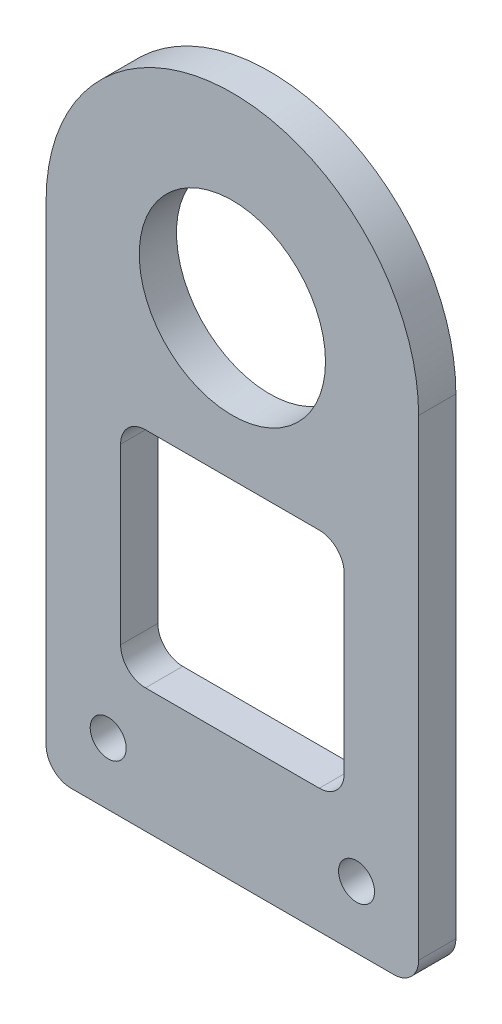
ISO-10303-21;
HEADER;
FILE_DESCRIPTION(('STEP AP214'),'2;1');
FILE_NAME('part.step','',(''),(''),'','','');
FILE_SCHEMA(('AUTOMOTIVE_DESIGN { 1 0 10303 214 1 1 1 1 }'));
ENDSEC;
DATA;
#1=APPLICATION_CONTEXT('core data for automotive mechanical design processes');
#2=APPLICATION_PROTOCOL_DEFINITION('international standard','automotive_design',2000,#1);
#3=PRODUCT_CONTEXT('',#1,'mechanical');
#4=PRODUCT('Part','Part','',(#3));
#5=PRODUCT_RELATED_PRODUCT_CATEGORY('part','',(#4));
#6=PRODUCT_DEFINITION_FORMATION('','',#4);
#7=PRODUCT_DEFINITION_CONTEXT('part definition',#1,'design');
#8=PRODUCT_DEFINITION('design','',#6,#7);
#9=PRODUCT_DEFINITION_SHAPE('','',#8);
#10=(LENGTH_UNIT() NAMED_UNIT(*) SI_UNIT(.MILLI.,.METRE.));
#11=(NAMED_UNIT(*) PLANE_ANGLE_UNIT() SI_UNIT($,.RADIAN.));
#12=(NAMED_UNIT(*) SI_UNIT($,.STERADIAN.) SOLID_ANGLE_UNIT());
#13=UNCERTAINTY_MEASURE_WITH_UNIT(LENGTH_MEASURE(1.E-05),#10,'distance_accuracy_value','');
#14=(GEOMETRIC_REPRESENTATION_CONTEXT(3) GLOBAL_UNCERTAINTY_ASSIGNED_CONTEXT((#13)) GLOBAL_UNIT_ASSIGNED_CONTEXT((#10,
#11,#12)) REPRESENTATION_CONTEXT('',''));
#15=CARTESIAN_POINT('',(0.,0.,0.));
#16=DIRECTION('',(0.,0.,1.));
#17=DIRECTION('',(1.,0.,0.));
#18=AXIS2_PLACEMENT_3D('',#15,#16,#17);
#19=CARTESIAN_POINT('',(0.,35.,3.));
#20=DIRECTION('',(0.,0.,1.));
#21=DIRECTION('',(1.,0.,0.));
#22=AXIS2_PLACEMENT_3D('',#19,#20,#21);
#23=PLANE('',#22);
#24=CARTESIAN_POINT('',(-10.,0.,3.));
#25=DIRECTION('',(0.,0.,1.));
#26=DIRECTION('',(1.,0.,0.));
#27=AXIS2_PLACEMENT_3D('',#24,#25,#26);
#28=CIRCLE('',#27,1.45);
#29=CARTESIAN_POINT('',(-8.55,0.,3.));
#30=VERTEX_POINT('',#29);
#31=EDGE_CURVE('E307',#30,#30,#28,.T.);
#32=ORIENTED_EDGE('',*,*,#31,.F.);
#33=EDGE_LOOP('',(#32));
#34=FACE_BOUND('',#33,.T.);
#35=DIRECTION('',(1.,0.,0.));
#36=VECTOR('',#35,1.);
#37=CARTESIAN_POINT('',(15.,-4.99999999999999,3.));
#38=LINE('',#37,#36);
#39=CARTESIAN_POINT('',(-13.,-5.,3.));
#40=VERTEX_POINT('',#39);
#41=CARTESIAN_POINT('',(13.,-4.99999999999999,3.));
#42=VERTEX_POINT('',#41);
#43=EDGE_CURVE('E160',#40,#42,#38,.T.);
#44=ORIENTED_EDGE('',*,*,#43,.T.);
#45=CARTESIAN_POINT('',(13.,-3.,3.));
#46=DIRECTION('',(0.,0.,1.));
#47=DIRECTION('',(1.,0.,0.));
#48=AXIS2_PLACEMENT_3D('',#45,#46,#47);
#49=CIRCLE('',#48,2.);
#50=CARTESIAN_POINT('',(15.,-3.,3.));
#51=VERTEX_POINT('',#50);
#52=EDGE_CURVE('E204',#42,#51,#49,.T.);
#53=ORIENTED_EDGE('',*,*,#52,.T.);
#54=DIRECTION('',(0.,1.,0.));
#55=VECTOR('',#54,1.);
#56=CARTESIAN_POINT('',(15.,35.,3.));
#57=LINE('',#56,#55);
#58=CARTESIAN_POINT('',(15.,35.,3.));
#59=VERTEX_POINT('',#58);
#60=EDGE_CURVE('E167',#51,#59,#57,.T.);
#61=ORIENTED_EDGE('',*,*,#60,.T.);
#62=CARTESIAN_POINT('',(0.,35.,3.));
#63=DIRECTION('',(0.,0.,1.));
#64=DIRECTION('',(1.,0.,0.));
#65=AXIS2_PLACEMENT_3D('',#62,#63,#64);
#66=CIRCLE('',#65,15.);
#67=CARTESIAN_POINT('',(-15.,35.,3.));
#68=VERTEX_POINT('',#67);
#69=EDGE_CURVE('E161',#59,#68,#66,.T.);
#70=ORIENTED_EDGE('',*,*,#69,.T.);
#71=DIRECTION('',(0.,-1.,0.));
#72=VECTOR('',#71,1.);
#73=CARTESIAN_POINT('',(-15.,35.,3.));
#74=LINE('',#73,#72);
#75=CARTESIAN_POINT('',(-15.,-3.,3.));
#76=VERTEX_POINT('',#75);
#77=EDGE_CURVE('E148',#68,#76,#74,.T.);
#78=ORIENTED_EDGE('',*,*,#77,.T.);
#79=CARTESIAN_POINT('',(-13.,-3.,3.));
#80=DIRECTION('',(0.,0.,1.));
#81=DIRECTION('',(1.,0.,0.));
#82=AXIS2_PLACEMENT_3D('',#79,#80,#81);
#83=CIRCLE('',#82,2.);
#84=EDGE_CURVE('E201',#76,#40,#83,.T.);
#85=ORIENTED_EDGE('',*,*,#84,.T.);
#86=EDGE_LOOP('',(#44,#53,#61,#70,#78,#85));
#87=FACE_BOUND('',#86,.T.);
#88=CARTESIAN_POINT('',(0.,35.,3.));
#89=DIRECTION('',(0.,0.,1.));
#90=DIRECTION('',(1.,0.,0.));
#91=AXIS2_PLACEMENT_3D('',#88,#89,#90);
#92=CIRCLE('',#91,7.5);
#93=CARTESIAN_POINT('',(7.5,35.,3.));
#94=VERTEX_POINT('',#93);
#95=EDGE_CURVE('E315',#94,#94,#92,.T.);
#96=ORIENTED_EDGE('',*,*,#95,.F.);
#97=EDGE_LOOP('',(#96));
#98=FACE_BOUND('',#97,.T.);
#99=CARTESIAN_POINT('',(10.,0.,3.));
#100=DIRECTION('',(0.,0.,1.));
#101=DIRECTION('',(1.,0.,0.));
#102=AXIS2_PLACEMENT_3D('',#99,#100,#101);
#103=CIRCLE('',#102,1.45);
#104=CARTESIAN_POINT('',(11.45,0.,3.));
#105=VERTEX_POINT('',#104);
#106=EDGE_CURVE('E299',#105,#105,#103,.T.);
#107=ORIENTED_EDGE('',*,*,#106,.F.);
#108=EDGE_LOOP('',(#107));
#109=FACE_BOUND('',#108,.T.);
#110=DIRECTION('',(-1.,0.,0.));
#111=VECTOR('',#110,1.);
#112=CARTESIAN_POINT('',(-9.,23.,3.));
#113=LINE('',#112,#111);
#114=CARTESIAN_POINT('',(7.,23.,3.));
#115=VERTEX_POINT('',#114);
#116=CARTESIAN_POINT('',(-7.,23.,3.));
#117=VERTEX_POINT('',#116);
#118=EDGE_CURVE('E271',#115,#117,#113,.T.);
#119=ORIENTED_EDGE('',*,*,#118,.F.);
#120=CARTESIAN_POINT('',(7.,21.,3.));
#121=DIRECTION('',(0.,0.,1.));
#122=DIRECTION('',(1.,0.,0.));
#123=AXIS2_PLACEMENT_3D('',#120,#121,#122);
#124=CIRCLE('',#123,2.);
#125=CARTESIAN_POINT('',(9.,21.,3.));
#126=VERTEX_POINT('',#125);
#127=EDGE_CURVE('E250',#115,#126,#124,.F.);
#128=ORIENTED_EDGE('',*,*,#127,.T.);
#129=DIRECTION('',(0.,1.,0.));
#130=VECTOR('',#129,1.);
#131=CARTESIAN_POINT('',(9.,5.,3.));
#132=LINE('',#131,#130);
#133=CARTESIAN_POINT('',(9.,7.,3.));
#134=VERTEX_POINT('',#133);
#135=EDGE_CURVE('E278',#134,#126,#132,.T.);
#136=ORIENTED_EDGE('',*,*,#135,.F.);
#137=CARTESIAN_POINT('',(7.,7.,3.));
#138=DIRECTION('',(0.,0.,1.));
#139=DIRECTION('',(1.,0.,0.));
#140=AXIS2_PLACEMENT_3D('',#137,#138,#139);
#141=CIRCLE('',#140,2.);
#142=CARTESIAN_POINT('',(7.,5.,3.));
#143=VERTEX_POINT('',#142);
#144=EDGE_CURVE('E244',#134,#143,#141,.F.);
#145=ORIENTED_EDGE('',*,*,#144,.T.);
#146=DIRECTION('',(1.,0.,0.));
#147=VECTOR('',#146,1.);
#148=CARTESIAN_POINT('',(-9.,5.,3.));
#149=LINE('',#148,#147);
#150=CARTESIAN_POINT('',(-7.,5.,3.));
#151=VERTEX_POINT('',#150);
#152=EDGE_CURVE('E282',#151,#143,#149,.T.);
#153=ORIENTED_EDGE('',*,*,#152,.F.);
#154=CARTESIAN_POINT('',(-7.,7.,3.));
#155=DIRECTION('',(0.,0.,1.));
#156=DIRECTION('',(1.,0.,0.));
#157=AXIS2_PLACEMENT_3D('',#154,#155,#156);
#158=CIRCLE('',#157,2.);
#159=CARTESIAN_POINT('',(-9.,7.,3.));
#160=VERTEX_POINT('',#159);
#161=EDGE_CURVE('E61',#151,#160,#158,.F.);
#162=ORIENTED_EDGE('',*,*,#161,.T.);
#163=DIRECTION('',(0.,-1.,0.));
#164=VECTOR('',#163,1.);
#165=CARTESIAN_POINT('',(-9.,5.,3.));
#166=LINE('',#165,#164);
#167=CARTESIAN_POINT('',(-9.,21.,3.));
#168=VERTEX_POINT('',#167);
#169=EDGE_CURVE('E273',#168,#160,#166,.T.);
#170=ORIENTED_EDGE('',*,*,#169,.F.);
#171=CARTESIAN_POINT('',(-7.,21.,3.));
#172=DIRECTION('',(0.,0.,1.));
#173=DIRECTION('',(1.,0.,0.));
#174=AXIS2_PLACEMENT_3D('',#171,#172,#173);
#175=CIRCLE('',#174,2.);
#176=EDGE_CURVE('E11',#168,#117,#175,.F.);
#177=ORIENTED_EDGE('',*,*,#176,.T.);
#178=EDGE_LOOP('',(#119,#128,#136,#145,#153,#162,#170,#177));
#179=FACE_BOUND('',#178,.T.);
#180=ADVANCED_FACE('F45',(#34,#87,#98,#109,#179),#23,.T.);
#181=CARTESIAN_POINT('',(0.,35.,0.));
#182=DIRECTION('',(0.,0.,1.));
#183=DIRECTION('',(1.,0.,0.));
#184=AXIS2_PLACEMENT_3D('',#181,#182,#183);
#185=PLANE('',#184);
#186=CARTESIAN_POINT('',(10.,0.,0.));
#187=DIRECTION('',(0.,0.,1.));
#188=DIRECTION('',(1.,0.,0.));
#189=AXIS2_PLACEMENT_3D('',#186,#187,#188);
#190=CIRCLE('',#189,1.45);
#191=CARTESIAN_POINT('',(11.45,0.,0.));
#192=VERTEX_POINT('',#191);
#193=EDGE_CURVE('E290',#192,#192,#190,.T.);
#194=ORIENTED_EDGE('',*,*,#193,.T.);
#195=EDGE_LOOP('',(#194));
#196=FACE_BOUND('',#195,.T.);
#197=CARTESIAN_POINT('',(-10.,0.,0.));
#198=DIRECTION('',(0.,0.,1.));
#199=DIRECTION('',(1.,0.,0.));
#200=AXIS2_PLACEMENT_3D('',#197,#198,#199);
#201=CIRCLE('',#200,1.45);
#202=CARTESIAN_POINT('',(-8.55,0.,0.));
#203=VERTEX_POINT('',#202);
#204=EDGE_CURVE('E303',#203,#203,#201,.T.);
#205=ORIENTED_EDGE('',*,*,#204,.T.);
#206=EDGE_LOOP('',(#205));
#207=FACE_BOUND('',#206,.T.);
#208=CARTESIAN_POINT('',(0.,35.,0.));
#209=DIRECTION('',(0.,0.,1.));
#210=DIRECTION('',(1.,0.,0.));
#211=AXIS2_PLACEMENT_3D('',#208,#209,#210);
#212=CIRCLE('',#211,7.5);
#213=CARTESIAN_POINT('',(7.5,35.,0.));
#214=VERTEX_POINT('',#213);
#215=EDGE_CURVE('E311',#214,#214,#212,.T.);
#216=ORIENTED_EDGE('',*,*,#215,.T.);
#217=EDGE_LOOP('',(#216));
#218=FACE_BOUND('',#217,.T.);
#219=DIRECTION('',(0.,1.,0.));
#220=VECTOR('',#219,1.);
#221=CARTESIAN_POINT('',(15.,35.,0.));
#222=LINE('',#221,#220);
#223=CARTESIAN_POINT('',(15.,-3.,0.));
#224=VERTEX_POINT('',#223);
#225=CARTESIAN_POINT('',(15.,35.,0.));
#226=VERTEX_POINT('',#225);
#227=EDGE_CURVE('E172',#224,#226,#222,.T.);
#228=ORIENTED_EDGE('',*,*,#227,.F.);
#229=CARTESIAN_POINT('',(13.,-3.,0.));
#230=DIRECTION('',(0.,0.,1.));
#231=DIRECTION('',(1.,0.,0.));
#232=AXIS2_PLACEMENT_3D('',#229,#230,#231);
#233=CIRCLE('',#232,2.);
#234=CARTESIAN_POINT('',(13.,-4.99999999999999,0.));
#235=VERTEX_POINT('',#234);
#236=EDGE_CURVE('E191',#224,#235,#233,.F.);
#237=ORIENTED_EDGE('',*,*,#236,.T.);
#238=DIRECTION('',(1.,0.,0.));
#239=VECTOR('',#238,1.);
#240=CARTESIAN_POINT('',(15.,-4.99999999999999,0.));
#241=LINE('',#240,#239);
#242=CARTESIAN_POINT('',(-13.,-5.,0.));
#243=VERTEX_POINT('',#242);
#244=EDGE_CURVE('E331',#243,#235,#241,.T.);
#245=ORIENTED_EDGE('',*,*,#244,.F.);
#246=CARTESIAN_POINT('',(-13.,-3.,0.));
#247=DIRECTION('',(0.,0.,1.));
#248=DIRECTION('',(1.,0.,0.));
#249=AXIS2_PLACEMENT_3D('',#246,#247,#248);
#250=CIRCLE('',#249,2.);
#251=CARTESIAN_POINT('',(-15.,-3.,0.));
#252=VERTEX_POINT('',#251);
#253=EDGE_CURVE('E184',#243,#252,#250,.F.);
#254=ORIENTED_EDGE('',*,*,#253,.T.);
#255=DIRECTION('',(0.,-1.,0.));
#256=VECTOR('',#255,1.);
#257=CARTESIAN_POINT('',(-15.,35.,0.));
#258=LINE('',#257,#256);
#259=CARTESIAN_POINT('',(-15.,35.,0.));
#260=VERTEX_POINT('',#259);
#261=EDGE_CURVE('E328',#260,#252,#258,.T.);
#262=ORIENTED_EDGE('',*,*,#261,.F.);
#263=CARTESIAN_POINT('',(0.,35.,0.));
#264=DIRECTION('',(0.,0.,1.));
#265=DIRECTION('',(1.,0.,0.));
#266=AXIS2_PLACEMENT_3D('',#263,#264,#265);
#267=CIRCLE('',#266,15.);
#268=EDGE_CURVE('E176',#226,#260,#267,.T.);
#269=ORIENTED_EDGE('',*,*,#268,.F.);
#270=EDGE_LOOP('',(#228,#237,#245,#254,#262,#269));
#271=FACE_BOUND('',#270,.T.);
#272=DIRECTION('',(1.,0.,0.));
#273=VECTOR('',#272,1.);
#274=CARTESIAN_POINT('',(-9.,5.,0.));
#275=LINE('',#274,#273);
#276=CARTESIAN_POINT('',(-7.,5.,0.));
#277=VERTEX_POINT('',#276);
#278=CARTESIAN_POINT('',(7.,5.,0.));
#279=VERTEX_POINT('',#278);
#280=EDGE_CURVE('E266',#277,#279,#275,.T.);
#281=ORIENTED_EDGE('',*,*,#280,.T.);
#282=CARTESIAN_POINT('',(7.,7.,0.));
#283=DIRECTION('',(0.,0.,1.));
#284=DIRECTION('',(1.,0.,0.));
#285=AXIS2_PLACEMENT_3D('',#282,#283,#284);
#286=CIRCLE('',#285,2.);
#287=CARTESIAN_POINT('',(9.,7.,0.));
#288=VERTEX_POINT('',#287);
#289=EDGE_CURVE('E241',#279,#288,#286,.T.);
#290=ORIENTED_EDGE('',*,*,#289,.T.);
#291=DIRECTION('',(0.,1.,0.));
#292=VECTOR('',#291,1.);
#293=CARTESIAN_POINT('',(9.,5.,0.));
#294=LINE('',#293,#292);
#295=CARTESIAN_POINT('',(9.,21.,0.));
#296=VERTEX_POINT('',#295);
#297=EDGE_CURVE('E291',#288,#296,#294,.T.);
#298=ORIENTED_EDGE('',*,*,#297,.T.);
#299=CARTESIAN_POINT('',(7.,21.,0.));
#300=DIRECTION('',(0.,0.,1.));
#301=DIRECTION('',(1.,0.,0.));
#302=AXIS2_PLACEMENT_3D('',#299,#300,#301);
#303=CIRCLE('',#302,2.);
#304=CARTESIAN_POINT('',(7.,23.,0.));
#305=VERTEX_POINT('',#304);
#306=EDGE_CURVE('E247',#296,#305,#303,.T.);
#307=ORIENTED_EDGE('',*,*,#306,.T.);
#308=DIRECTION('',(-1.,0.,0.));
#309=VECTOR('',#308,1.);
#310=CARTESIAN_POINT('',(-9.,23.,0.));
#311=LINE('',#310,#309);
#312=CARTESIAN_POINT('',(-7.,23.,0.));
#313=VERTEX_POINT('',#312);
#314=EDGE_CURVE('E260',#305,#313,#311,.T.);
#315=ORIENTED_EDGE('',*,*,#314,.T.);
#316=CARTESIAN_POINT('',(-7.,21.,0.));
#317=DIRECTION('',(0.,0.,1.));
#318=DIRECTION('',(1.,0.,0.));
#319=AXIS2_PLACEMENT_3D('',#316,#317,#318);
#320=CIRCLE('',#319,2.);
#321=CARTESIAN_POINT('',(-9.,21.,0.));
#322=VERTEX_POINT('',#321);
#323=EDGE_CURVE('E54',#313,#322,#320,.T.);
#324=ORIENTED_EDGE('',*,*,#323,.T.);
#325=DIRECTION('',(0.,-1.,0.));
#326=VECTOR('',#325,1.);
#327=CARTESIAN_POINT('',(-9.,5.,0.));
#328=LINE('',#327,#326);
#329=CARTESIAN_POINT('',(-9.,7.,0.));
#330=VERTEX_POINT('',#329);
#331=EDGE_CURVE('E258',#322,#330,#328,.T.);
#332=ORIENTED_EDGE('',*,*,#331,.T.);
#333=CARTESIAN_POINT('',(-7.,7.,0.));
#334=DIRECTION('',(0.,0.,1.));
#335=DIRECTION('',(1.,0.,0.));
#336=AXIS2_PLACEMENT_3D('',#333,#334,#335);
#337=CIRCLE('',#336,2.);
#338=EDGE_CURVE('E236',#330,#277,#337,.T.);
#339=ORIENTED_EDGE('',*,*,#338,.T.);
#340=EDGE_LOOP('',(#281,#290,#298,#307,#315,#324,#332,#339));
#341=FACE_BOUND('',#340,.T.);
#342=ADVANCED_FACE('F257',(#196,#207,#218,#271,#341),#185,.F.);
#343=CARTESIAN_POINT('',(0.,35.,3.));
#344=DIRECTION('',(0.,0.,-1.));
#345=DIRECTION('',(-1.,0.,0.));
#346=AXIS2_PLACEMENT_3D('',#343,#344,#345);
#347=CYLINDRICAL_SURFACE('',#346,15.);
#348=ORIENTED_EDGE('',*,*,#268,.T.);
#349=DIRECTION('',(0.,0.,-1.));
#350=VECTOR('',#349,1.);
#351=CARTESIAN_POINT('',(-15.,35.,3.));
#352=LINE('',#351,#350);
#353=EDGE_CURVE('E153',#68,#260,#352,.T.);
#354=ORIENTED_EDGE('',*,*,#353,.F.);
#355=ORIENTED_EDGE('',*,*,#69,.F.);
#356=DIRECTION('',(0.,0.,-1.));
#357=VECTOR('',#356,1.);
#358=CARTESIAN_POINT('',(15.,35.,3.));
#359=LINE('',#358,#357);
#360=EDGE_CURVE('E179',#59,#226,#359,.T.);
#361=ORIENTED_EDGE('',*,*,#360,.T.);
#362=EDGE_LOOP('',(#348,#354,#355,#361));
#363=FACE_BOUND('',#362,.T.);
#364=ADVANCED_FACE('F174',(#363),#347,.T.);
#365=CARTESIAN_POINT('',(-15.,35.,3.));
#366=DIRECTION('',(1.,0.,0.));
#367=DIRECTION('',(0.,1.,0.));
#368=AXIS2_PLACEMENT_3D('',#365,#366,#367);
#369=PLANE('',#368);
#370=ORIENTED_EDGE('',*,*,#261,.T.);
#371=DIRECTION('',(0.,0.,-1.));
#372=VECTOR('',#371,1.);
#373=CARTESIAN_POINT('',(-15.,-3.,3.));
#374=LINE('',#373,#372);
#375=EDGE_CURVE('E156',#252,#76,#374,.F.);
#376=ORIENTED_EDGE('',*,*,#375,.T.);
#377=ORIENTED_EDGE('',*,*,#77,.F.);
#378=ORIENTED_EDGE('',*,*,#353,.T.);
#379=EDGE_LOOP('',(#370,#376,#377,#378));
#380=FACE_BOUND('',#379,.T.);
#381=ADVANCED_FACE('F151',(#380),#369,.F.);
#382=CARTESIAN_POINT('',(15.,-4.99999999999999,3.));
#383=DIRECTION('',(0.,1.,0.));
#384=DIRECTION('',(-1.,0.,0.));
#385=AXIS2_PLACEMENT_3D('',#382,#383,#384);
#386=PLANE('',#385);
#387=ORIENTED_EDGE('',*,*,#244,.T.);
#388=DIRECTION('',(0.,0.,-1.));
#389=VECTOR('',#388,1.);
#390=CARTESIAN_POINT('',(13.,-4.99999999999999,3.));
#391=LINE('',#390,#389);
#392=EDGE_CURVE('E198',#235,#42,#391,.F.);
#393=ORIENTED_EDGE('',*,*,#392,.T.);
#394=ORIENTED_EDGE('',*,*,#43,.F.);
#395=DIRECTION('',(0.,0.,-1.));
#396=VECTOR('',#395,1.);
#397=CARTESIAN_POINT('',(-13.,-5.,3.));
#398=LINE('',#397,#396);
#399=EDGE_CURVE('E194',#40,#243,#398,.T.);
#400=ORIENTED_EDGE('',*,*,#399,.T.);
#401=EDGE_LOOP('',(#387,#393,#394,#400));
#402=FACE_BOUND('',#401,.T.);
#403=ADVANCED_FACE('F347',(#402),#386,.F.);
#404=CARTESIAN_POINT('',(15.,35.,3.));
#405=DIRECTION('',(-1.,0.,0.));
#406=DIRECTION('',(0.,0.,1.));
#407=AXIS2_PLACEMENT_3D('',#404,#405,#406);
#408=PLANE('',#407);
#409=ORIENTED_EDGE('',*,*,#60,.F.);
#410=DIRECTION('',(0.,0.,-1.));
#411=VECTOR('',#410,1.);
#412=CARTESIAN_POINT('',(15.,-3.,3.));
#413=LINE('',#412,#411);
#414=EDGE_CURVE('E178',#51,#224,#413,.T.);
#415=ORIENTED_EDGE('',*,*,#414,.T.);
#416=ORIENTED_EDGE('',*,*,#227,.T.);
#417=ORIENTED_EDGE('',*,*,#360,.F.);
#418=EDGE_LOOP('',(#409,#415,#416,#417));
#419=FACE_BOUND('',#418,.T.);
#420=ADVANCED_FACE('F337',(#419),#408,.F.);
#421=CARTESIAN_POINT('',(0.,35.,3.));
#422=DIRECTION('',(0.,0.,-1.));
#423=DIRECTION('',(-1.,0.,0.));
#424=AXIS2_PLACEMENT_3D('',#421,#422,#423);
#425=CYLINDRICAL_SURFACE('',#424,7.5);
#426=ORIENTED_EDGE('',*,*,#95,.T.);
#427=EDGE_LOOP('',(#426));
#428=FACE_BOUND('',#427,.T.);
#429=ORIENTED_EDGE('',*,*,#215,.F.);
#430=EDGE_LOOP('',(#429));
#431=FACE_BOUND('',#430,.T.);
#432=ADVANCED_FACE('F374',(#428,#431),#425,.F.);
#433=CARTESIAN_POINT('',(-10.,0.,3.));
#434=DIRECTION('',(0.,0.,-1.));
#435=DIRECTION('',(-1.,0.,0.));
#436=AXIS2_PLACEMENT_3D('',#433,#434,#435);
#437=CYLINDRICAL_SURFACE('',#436,1.45);
#438=ORIENTED_EDGE('',*,*,#31,.T.);
#439=EDGE_LOOP('',(#438));
#440=FACE_BOUND('',#439,.T.);
#441=ORIENTED_EDGE('',*,*,#204,.F.);
#442=EDGE_LOOP('',(#441));
#443=FACE_BOUND('',#442,.T.);
#444=ADVANCED_FACE('F394',(#440,#443),#437,.F.);
#445=CARTESIAN_POINT('',(10.,0.,3.));
#446=DIRECTION('',(0.,0.,-1.));
#447=DIRECTION('',(-1.,0.,0.));
#448=AXIS2_PLACEMENT_3D('',#445,#446,#447);
#449=CYLINDRICAL_SURFACE('',#448,1.45);
#450=ORIENTED_EDGE('',*,*,#106,.T.);
#451=EDGE_LOOP('',(#450));
#452=FACE_BOUND('',#451,.T.);
#453=ORIENTED_EDGE('',*,*,#193,.F.);
#454=EDGE_LOOP('',(#453));
#455=FACE_BOUND('',#454,.T.);
#456=ADVANCED_FACE('F402',(#452,#455),#449,.F.);
#457=CARTESIAN_POINT('',(9.,5.,3.));
#458=DIRECTION('',(-1.,0.,0.));
#459=DIRECTION('',(0.,0.,1.));
#460=AXIS2_PLACEMENT_3D('',#457,#458,#459);
#461=PLANE('',#460);
#462=ORIENTED_EDGE('',*,*,#297,.F.);
#463=DIRECTION('',(0.,0.,-1.));
#464=VECTOR('',#463,1.);
#465=CARTESIAN_POINT('',(9.,7.,3.));
#466=LINE('',#465,#464);
#467=EDGE_CURVE('E226',#288,#134,#466,.F.);
#468=ORIENTED_EDGE('',*,*,#467,.T.);
#469=ORIENTED_EDGE('',*,*,#135,.T.);
#470=DIRECTION('',(0.,0.,-1.));
#471=VECTOR('',#470,1.);
#472=CARTESIAN_POINT('',(9.,21.,0.));
#473=LINE('',#472,#471);
#474=EDGE_CURVE('E222',#126,#296,#473,.T.);
#475=ORIENTED_EDGE('',*,*,#474,.T.);
#476=EDGE_LOOP('',(#462,#468,#469,#475));
#477=FACE_BOUND('',#476,.T.);
#478=ADVANCED_FACE('F409',(#477),#461,.T.);
#479=CARTESIAN_POINT('',(-9.,23.,3.));
#480=DIRECTION('',(0.,-1.,0.));
#481=DIRECTION('',(0.,0.,-1.));
#482=AXIS2_PLACEMENT_3D('',#479,#480,#481);
#483=PLANE('',#482);
#484=ORIENTED_EDGE('',*,*,#314,.F.);
#485=DIRECTION('',(0.,0.,-1.));
#486=VECTOR('',#485,1.);
#487=CARTESIAN_POINT('',(7.,23.,3.));
#488=LINE('',#487,#486);
#489=EDGE_CURVE('E233',#305,#115,#488,.F.);
#490=ORIENTED_EDGE('',*,*,#489,.T.);
#491=ORIENTED_EDGE('',*,*,#118,.T.);
#492=DIRECTION('',(0.,0.,-1.));
#493=VECTOR('',#492,1.);
#494=CARTESIAN_POINT('',(-7.,23.,0.));
#495=LINE('',#494,#493);
#496=EDGE_CURVE('E229',#117,#313,#495,.T.);
#497=ORIENTED_EDGE('',*,*,#496,.T.);
#498=EDGE_LOOP('',(#484,#490,#491,#497));
#499=FACE_BOUND('',#498,.T.);
#500=ADVANCED_FACE('F275',(#499),#483,.T.);
#501=CARTESIAN_POINT('',(-9.,5.,3.));
#502=DIRECTION('',(1.,0.,0.));
#503=DIRECTION('',(0.,0.,-1.));
#504=AXIS2_PLACEMENT_3D('',#501,#502,#503);
#505=PLANE('',#504);
#506=ORIENTED_EDGE('',*,*,#169,.T.);
#507=DIRECTION('',(0.,0.,-1.));
#508=VECTOR('',#507,1.);
#509=CARTESIAN_POINT('',(-9.,7.,0.));
#510=LINE('',#509,#508);
#511=EDGE_CURVE('E211',#160,#330,#510,.T.);
#512=ORIENTED_EDGE('',*,*,#511,.T.);
#513=ORIENTED_EDGE('',*,*,#331,.F.);
#514=DIRECTION('',(0.,0.,-1.));
#515=VECTOR('',#514,1.);
#516=CARTESIAN_POINT('',(-9.,21.,3.));
#517=LINE('',#516,#515);
#518=EDGE_CURVE('E68',#322,#168,#517,.F.);
#519=ORIENTED_EDGE('',*,*,#518,.T.);
#520=EDGE_LOOP('',(#506,#512,#513,#519));
#521=FACE_BOUND('',#520,.T.);
#522=ADVANCED_FACE('F263',(#521),#505,.T.);
#523=CARTESIAN_POINT('',(-9.,5.,3.));
#524=DIRECTION('',(0.,1.,0.));
#525=DIRECTION('',(0.,0.,1.));
#526=AXIS2_PLACEMENT_3D('',#523,#524,#525);
#527=PLANE('',#526);
#528=ORIENTED_EDGE('',*,*,#280,.F.);
#529=DIRECTION('',(0.,0.,-1.));
#530=VECTOR('',#529,1.);
#531=CARTESIAN_POINT('',(-7.,5.,3.));
#532=LINE('',#531,#530);
#533=EDGE_CURVE('E219',#277,#151,#532,.F.);
#534=ORIENTED_EDGE('',*,*,#533,.T.);
#535=ORIENTED_EDGE('',*,*,#152,.T.);
#536=DIRECTION('',(0.,0.,-1.));
#537=VECTOR('',#536,1.);
#538=CARTESIAN_POINT('',(7.,5.,0.));
#539=LINE('',#538,#537);
#540=EDGE_CURVE('E215',#143,#279,#539,.T.);
#541=ORIENTED_EDGE('',*,*,#540,.T.);
#542=EDGE_LOOP('',(#528,#534,#535,#541));
#543=FACE_BOUND('',#542,.T.);
#544=ADVANCED_FACE('F352',(#543),#527,.T.);
#545=CARTESIAN_POINT('',(13.,-3.,3.));
#546=DIRECTION('',(0.,0.,-1.));
#547=DIRECTION('',(-1.,0.,0.));
#548=AXIS2_PLACEMENT_3D('',#545,#546,#547);
#549=CYLINDRICAL_SURFACE('',#548,2.);
#550=ORIENTED_EDGE('',*,*,#52,.F.);
#551=ORIENTED_EDGE('',*,*,#392,.F.);
#552=ORIENTED_EDGE('',*,*,#236,.F.);
#553=ORIENTED_EDGE('',*,*,#414,.F.);
#554=EDGE_LOOP('',(#550,#551,#552,#553));
#555=FACE_BOUND('',#554,.T.);
#556=ADVANCED_FACE('F350',(#555),#549,.T.);
#557=CARTESIAN_POINT('',(-13.,-3.,3.));
#558=DIRECTION('',(0.,0.,-1.));
#559=DIRECTION('',(-1.,0.,0.));
#560=AXIS2_PLACEMENT_3D('',#557,#558,#559);
#561=CYLINDRICAL_SURFACE('',#560,2.);
#562=ORIENTED_EDGE('',*,*,#84,.F.);
#563=ORIENTED_EDGE('',*,*,#375,.F.);
#564=ORIENTED_EDGE('',*,*,#253,.F.);
#565=ORIENTED_EDGE('',*,*,#399,.F.);
#566=EDGE_LOOP('',(#562,#563,#564,#565));
#567=FACE_BOUND('',#566,.T.);
#568=ADVANCED_FACE('F342',(#567),#561,.T.);
#569=CARTESIAN_POINT('',(-7.,7.,3.));
#570=DIRECTION('',(0.,0.,1.));
#571=DIRECTION('',(1.,0.,0.));
#572=AXIS2_PLACEMENT_3D('',#569,#570,#571);
#573=CYLINDRICAL_SURFACE('',#572,2.);
#574=ORIENTED_EDGE('',*,*,#161,.F.);
#575=ORIENTED_EDGE('',*,*,#533,.F.);
#576=ORIENTED_EDGE('',*,*,#338,.F.);
#577=ORIENTED_EDGE('',*,*,#511,.F.);
#578=EDGE_LOOP('',(#574,#575,#576,#577));
#579=FACE_BOUND('',#578,.T.);
#580=ADVANCED_FACE('F358',(#579),#573,.F.);
#581=CARTESIAN_POINT('',(7.,7.,3.));
#582=DIRECTION('',(0.,0.,1.));
#583=DIRECTION('',(1.,0.,0.));
#584=AXIS2_PLACEMENT_3D('',#581,#582,#583);
#585=CYLINDRICAL_SURFACE('',#584,2.);
#586=ORIENTED_EDGE('',*,*,#144,.F.);
#587=ORIENTED_EDGE('',*,*,#467,.F.);
#588=ORIENTED_EDGE('',*,*,#289,.F.);
#589=ORIENTED_EDGE('',*,*,#540,.F.);
#590=EDGE_LOOP('',(#586,#587,#588,#589));
#591=FACE_BOUND('',#590,.T.);
#592=ADVANCED_FACE('F463',(#591),#585,.F.);
#593=CARTESIAN_POINT('',(7.,21.,3.));
#594=DIRECTION('',(0.,0.,1.));
#595=DIRECTION('',(1.,0.,0.));
#596=AXIS2_PLACEMENT_3D('',#593,#594,#595);
#597=CYLINDRICAL_SURFACE('',#596,2.);
#598=ORIENTED_EDGE('',*,*,#127,.F.);
#599=ORIENTED_EDGE('',*,*,#489,.F.);
#600=ORIENTED_EDGE('',*,*,#306,.F.);
#601=ORIENTED_EDGE('',*,*,#474,.F.);
#602=EDGE_LOOP('',(#598,#599,#600,#601));
#603=FACE_BOUND('',#602,.T.);
#604=ADVANCED_FACE('F473',(#603),#597,.F.);
#605=CARTESIAN_POINT('',(-7.,21.,3.));
#606=DIRECTION('',(0.,0.,1.));
#607=DIRECTION('',(1.,0.,0.));
#608=AXIS2_PLACEMENT_3D('',#605,#606,#607);
#609=CYLINDRICAL_SURFACE('',#608,2.);
#610=ORIENTED_EDGE('',*,*,#176,.F.);
#611=ORIENTED_EDGE('',*,*,#518,.F.);
#612=ORIENTED_EDGE('',*,*,#323,.F.);
#613=ORIENTED_EDGE('',*,*,#496,.F.);
#614=EDGE_LOOP('',(#610,#611,#612,#613));
#615=FACE_BOUND('',#614,.T.);
#616=ADVANCED_FACE('F47',(#615),#609,.F.);
#617=CLOSED_SHELL('',(#180,#342,#364,#381,#403,#420,#432,#444,#456,#478,#500,#522,#544,#556,
#568,#580,#592,#604,#616));
#618=MANIFOLD_SOLID_BREP('B2',#617);
#619=ADVANCED_BREP_SHAPE_REPRESENTATION('',(#18,#618),#14);
#620=SHAPE_DEFINITION_REPRESENTATION(#9,#619);
ENDSEC;
END-ISO-10303-21;
